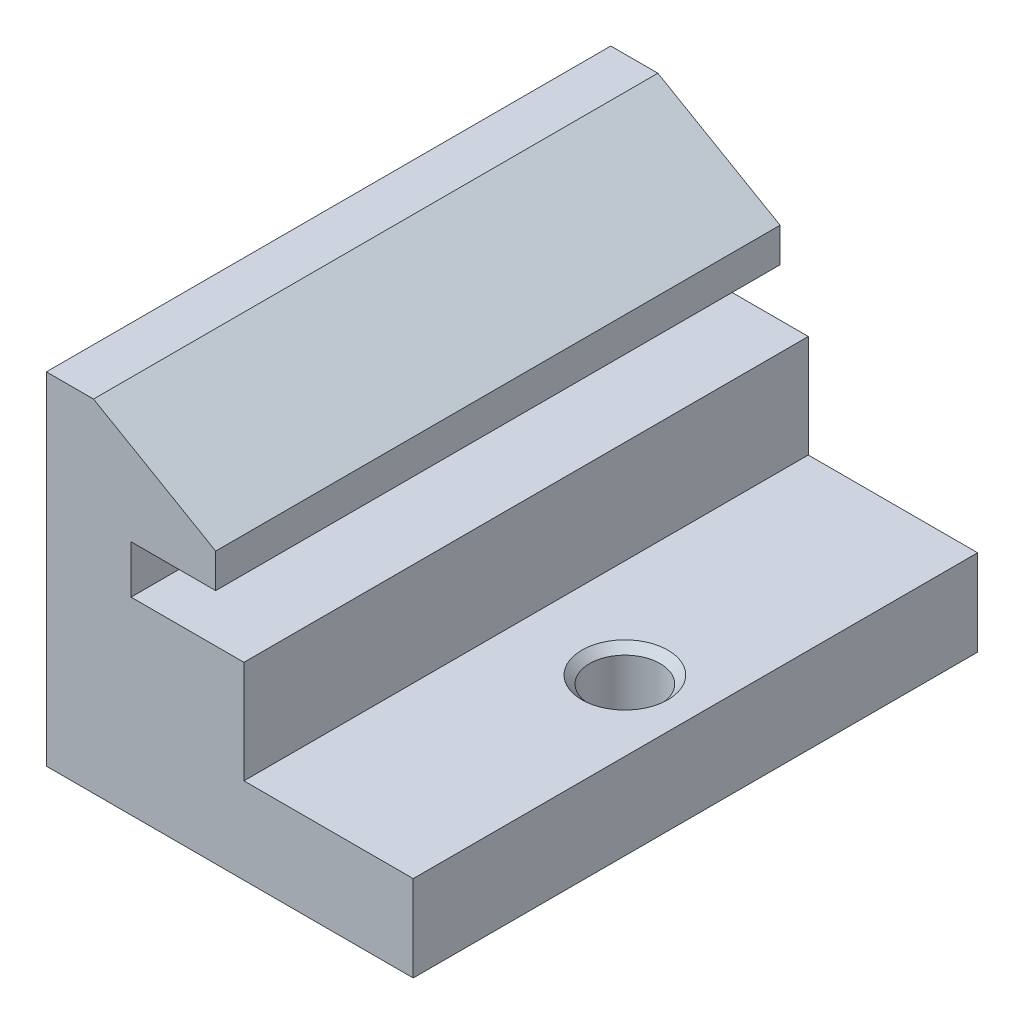
ISO-10303-21;
HEADER;
FILE_DESCRIPTION(('STEP AP214'),'2;1');
FILE_NAME('part.step','',(''),(''),'','','');
FILE_SCHEMA(('AUTOMOTIVE_DESIGN { 1 0 10303 214 1 1 1 1 }'));
ENDSEC;
DATA;
#1=APPLICATION_CONTEXT('core data for automotive mechanical design processes');
#2=APPLICATION_PROTOCOL_DEFINITION('international standard','automotive_design',2000,#1);
#3=PRODUCT_CONTEXT('',#1,'mechanical');
#4=PRODUCT('Part','Part','',(#3));
#5=PRODUCT_RELATED_PRODUCT_CATEGORY('part','',(#4));
#6=PRODUCT_DEFINITION_FORMATION('','',#4);
#7=PRODUCT_DEFINITION_CONTEXT('part definition',#1,'design');
#8=PRODUCT_DEFINITION('design','',#6,#7);
#9=PRODUCT_DEFINITION_SHAPE('','',#8);
#10=(LENGTH_UNIT() NAMED_UNIT(*) SI_UNIT(.MILLI.,.METRE.));
#11=(NAMED_UNIT(*) PLANE_ANGLE_UNIT() SI_UNIT($,.RADIAN.));
#12=(NAMED_UNIT(*) SI_UNIT($,.STERADIAN.) SOLID_ANGLE_UNIT());
#13=UNCERTAINTY_MEASURE_WITH_UNIT(LENGTH_MEASURE(1.E-05),#10,'distance_accuracy_value','');
#14=(GEOMETRIC_REPRESENTATION_CONTEXT(3) GLOBAL_UNCERTAINTY_ASSIGNED_CONTEXT((#13)) GLOBAL_UNIT_ASSIGNED_CONTEXT((#10,
#11,#12)) REPRESENTATION_CONTEXT('',''));
#15=CARTESIAN_POINT('',(0.,0.,0.));
#16=DIRECTION('',(0.,0.,1.));
#17=DIRECTION('',(1.,0.,0.));
#18=AXIS2_PLACEMENT_3D('',#15,#16,#17);
#19=CARTESIAN_POINT('',(0.,0.,20.));
#20=DIRECTION('',(-1.,0.,0.));
#21=DIRECTION('',(0.,0.,1.));
#22=AXIS2_PLACEMENT_3D('',#19,#20,#21);
#23=PLANE('',#22);
#24=DIRECTION('',(0.,1.,0.));
#25=VECTOR('',#24,1.);
#26=CARTESIAN_POINT('',(0.,0.,0.));
#27=LINE('',#26,#25);
#28=CARTESIAN_POINT('',(0.,0.,0.));
#29=VERTEX_POINT('',#28);
#30=CARTESIAN_POINT('',(0.,1.7,0.));
#31=VERTEX_POINT('',#30);
#32=EDGE_CURVE('E138',#29,#31,#27,.T.);
#33=ORIENTED_EDGE('',*,*,#32,.T.);
#34=DIRECTION('',(0.,0.,-1.));
#35=VECTOR('',#34,1.);
#36=CARTESIAN_POINT('',(0.,1.7,20.));
#37=LINE('',#36,#35);
#38=CARTESIAN_POINT('',(0.,1.7,20.));
#39=VERTEX_POINT('',#38);
#40=EDGE_CURVE('E120',#39,#31,#37,.T.);
#41=ORIENTED_EDGE('',*,*,#40,.F.);
#42=DIRECTION('',(0.,1.,0.));
#43=VECTOR('',#42,1.);
#44=CARTESIAN_POINT('',(0.,0.,20.));
#45=LINE('',#44,#43);
#46=CARTESIAN_POINT('',(0.,0.,20.));
#47=VERTEX_POINT('',#46);
#48=EDGE_CURVE('E126',#47,#39,#45,.T.);
#49=ORIENTED_EDGE('',*,*,#48,.F.);
#50=DIRECTION('',(0.,0.,-1.));
#51=VECTOR('',#50,1.);
#52=CARTESIAN_POINT('',(0.,0.,20.));
#53=LINE('',#52,#51);
#54=EDGE_CURVE('E164',#47,#29,#53,.T.);
#55=ORIENTED_EDGE('',*,*,#54,.T.);
#56=EDGE_LOOP('',(#33,#41,#49,#55));
#57=FACE_BOUND('',#56,.T.);
#58=ADVANCED_FACE('F33',(#57),#23,.F.);
#59=CARTESIAN_POINT('',(0.,1.7,20.));
#60=DIRECTION('',(0.,1.,0.));
#61=DIRECTION('',(0.,0.,1.));
#62=AXIS2_PLACEMENT_3D('',#59,#60,#61);
#63=PLANE('',#62);
#64=DIRECTION('',(1.,0.,0.));
#65=VECTOR('',#64,1.);
#66=CARTESIAN_POINT('',(0.,1.7,0.));
#67=LINE('',#66,#65);
#68=CARTESIAN_POINT('',(3.,1.7,0.));
#69=VERTEX_POINT('',#68);
#70=EDGE_CURVE('E181',#31,#69,#67,.T.);
#71=ORIENTED_EDGE('',*,*,#70,.T.);
#72=DIRECTION('',(0.,0.,-1.));
#73=VECTOR('',#72,1.);
#74=CARTESIAN_POINT('',(3.,1.7,20.));
#75=LINE('',#74,#73);
#76=CARTESIAN_POINT('',(3.,1.7,20.));
#77=VERTEX_POINT('',#76);
#78=EDGE_CURVE('E123',#77,#69,#75,.T.);
#79=ORIENTED_EDGE('',*,*,#78,.F.);
#80=DIRECTION('',(1.,0.,0.));
#81=VECTOR('',#80,1.);
#82=CARTESIAN_POINT('',(0.,1.7,20.));
#83=LINE('',#82,#81);
#84=EDGE_CURVE('E116',#39,#77,#83,.T.);
#85=ORIENTED_EDGE('',*,*,#84,.F.);
#86=ORIENTED_EDGE('',*,*,#40,.T.);
#87=EDGE_LOOP('',(#71,#79,#85,#86));
#88=FACE_BOUND('',#87,.T.);
#89=ADVANCED_FACE('F118',(#88),#63,.F.);
#90=CARTESIAN_POINT('',(3.,1.7,20.));
#91=DIRECTION('',(-1.,0.,0.));
#92=DIRECTION('',(0.,0.,1.));
#93=AXIS2_PLACEMENT_3D('',#90,#91,#92);
#94=PLANE('',#93);
#95=DIRECTION('',(0.,1.,0.));
#96=VECTOR('',#95,1.);
#97=CARTESIAN_POINT('',(3.,1.7,0.));
#98=LINE('',#97,#96);
#99=CARTESIAN_POINT('',(3.,2.91443072064569,0.));
#100=VERTEX_POINT('',#99);
#101=EDGE_CURVE('E179',#69,#100,#98,.T.);
#102=ORIENTED_EDGE('',*,*,#101,.T.);
#103=DIRECTION('',(0.,0.,1.));
#104=VECTOR('',#103,1.);
#105=CARTESIAN_POINT('',(3.,2.91443072064569,20.));
#106=LINE('',#105,#104);
#107=CARTESIAN_POINT('',(3.,2.91443072064569,20.));
#108=VERTEX_POINT('',#107);
#109=EDGE_CURVE('E41',#100,#108,#106,.T.);
#110=ORIENTED_EDGE('',*,*,#109,.T.);
#111=DIRECTION('',(0.,1.,0.));
#112=VECTOR('',#111,1.);
#113=CARTESIAN_POINT('',(3.,1.7,20.));
#114=LINE('',#113,#112);
#115=EDGE_CURVE('E125',#77,#108,#114,.T.);
#116=ORIENTED_EDGE('',*,*,#115,.F.);
#117=ORIENTED_EDGE('',*,*,#78,.T.);
#118=EDGE_LOOP('',(#102,#110,#116,#117));
#119=FACE_BOUND('',#118,.T.);
#120=ADVANCED_FACE('F242',(#119),#94,.F.);
#121=CARTESIAN_POINT('',(3.,5.41443072064569,20.));
#122=DIRECTION('',(0.,-1.,0.));
#123=DIRECTION('',(1.,0.,0.));
#124=AXIS2_PLACEMENT_3D('',#121,#122,#123);
#125=PLANE('',#124);
#126=DIRECTION('',(-1.,0.,0.));
#127=VECTOR('',#126,1.);
#128=CARTESIAN_POINT('',(3.,5.41443072064569,20.));
#129=LINE('',#128,#127);
#130=CARTESIAN_POINT('',(-1.33012701892219,5.41443072064569,20.));
#131=VERTEX_POINT('',#130);
#132=CARTESIAN_POINT('',(-3.,5.41443072064569,20.));
#133=VERTEX_POINT('',#132);
#134=EDGE_CURVE('E196',#131,#133,#129,.T.);
#135=ORIENTED_EDGE('',*,*,#134,.F.);
#136=DIRECTION('',(0.,0.,-1.));
#137=VECTOR('',#136,1.);
#138=CARTESIAN_POINT('',(-1.33012701892219,5.41443072064569,20.));
#139=LINE('',#138,#137);
#140=CARTESIAN_POINT('',(-1.33012701892219,5.41443072064569,0.));
#141=VERTEX_POINT('',#140);
#142=EDGE_CURVE('E139',#131,#141,#139,.T.);
#143=ORIENTED_EDGE('',*,*,#142,.T.);
#144=DIRECTION('',(-1.,0.,0.));
#145=VECTOR('',#144,1.);
#146=CARTESIAN_POINT('',(3.,5.41443072064569,0.));
#147=LINE('',#146,#145);
#148=CARTESIAN_POINT('',(-3.,5.41443072064569,0.));
#149=VERTEX_POINT('',#148);
#150=EDGE_CURVE('E177',#141,#149,#147,.T.);
#151=ORIENTED_EDGE('',*,*,#150,.T.);
#152=DIRECTION('',(0.,0.,-1.));
#153=VECTOR('',#152,1.);
#154=CARTESIAN_POINT('',(-3.,5.41443072064569,20.));
#155=LINE('',#154,#153);
#156=EDGE_CURVE('E143',#133,#149,#155,.T.);
#157=ORIENTED_EDGE('',*,*,#156,.F.);
#158=EDGE_LOOP('',(#135,#143,#151,#157));
#159=FACE_BOUND('',#158,.T.);
#160=ADVANCED_FACE('F247',(#159),#125,.F.);
#161=CARTESIAN_POINT('',(-3.,5.41443072064569,20.));
#162=DIRECTION('',(1.,0.,0.));
#163=DIRECTION('',(0.,1.,0.));
#164=AXIS2_PLACEMENT_3D('',#161,#162,#163);
#165=PLANE('',#164);
#166=DIRECTION('',(0.,-1.,0.));
#167=VECTOR('',#166,1.);
#168=CARTESIAN_POINT('',(-3.,5.41443072064569,0.));
#169=LINE('',#168,#167);
#170=CARTESIAN_POINT('',(-3.,-6.68821772013365,0.));
#171=VERTEX_POINT('',#170);
#172=EDGE_CURVE('E175',#149,#171,#169,.T.);
#173=ORIENTED_EDGE('',*,*,#172,.T.);
#174=DIRECTION('',(0.,0.,-1.));
#175=VECTOR('',#174,1.);
#176=CARTESIAN_POINT('',(-3.,-6.68821772013365,20.));
#177=LINE('',#176,#175);
#178=CARTESIAN_POINT('',(-3.,-6.68821772013365,20.));
#179=VERTEX_POINT('',#178);
#180=EDGE_CURVE('E149',#179,#171,#177,.T.);
#181=ORIENTED_EDGE('',*,*,#180,.F.);
#182=DIRECTION('',(0.,-1.,0.));
#183=VECTOR('',#182,1.);
#184=CARTESIAN_POINT('',(-3.,5.41443072064569,20.));
#185=LINE('',#184,#183);
#186=EDGE_CURVE('E194',#133,#179,#185,.T.);
#187=ORIENTED_EDGE('',*,*,#186,.F.);
#188=ORIENTED_EDGE('',*,*,#156,.T.);
#189=EDGE_LOOP('',(#173,#181,#187,#188));
#190=FACE_BOUND('',#189,.T.);
#191=ADVANCED_FACE('F250',(#190),#165,.F.);
#192=CARTESIAN_POINT('',(-3.,-6.68821772013365,20.));
#193=DIRECTION('',(0.,1.,0.));
#194=DIRECTION('',(0.,0.,1.));
#195=AXIS2_PLACEMENT_3D('',#192,#193,#194);
#196=PLANE('',#195);
#197=CARTESIAN_POINT('',(7.5,-6.68821772013365,10.));
#198=DIRECTION('',(0.,1.,0.));
#199=DIRECTION('',(0.,0.,1.));
#200=AXIS2_PLACEMENT_3D('',#197,#198,#199);
#201=CIRCLE('',#200,1.25);
#202=CARTESIAN_POINT('',(7.5,-6.68821772013365,11.25));
#203=VERTEX_POINT('',#202);
#204=EDGE_CURVE('E184',#203,#203,#201,.T.);
#205=ORIENTED_EDGE('',*,*,#204,.T.);
#206=EDGE_LOOP('',(#205));
#207=FACE_BOUND('',#206,.T.);
#208=DIRECTION('',(1.,0.,0.));
#209=VECTOR('',#208,1.);
#210=CARTESIAN_POINT('',(-3.,-6.68821772013365,0.));
#211=LINE('',#210,#209);
#212=CARTESIAN_POINT('',(10.,-6.68821772013365,0.));
#213=VERTEX_POINT('',#212);
#214=EDGE_CURVE('E173',#171,#213,#211,.T.);
#215=ORIENTED_EDGE('',*,*,#214,.T.);
#216=DIRECTION('',(0.,0.,-1.));
#217=VECTOR('',#216,1.);
#218=CARTESIAN_POINT('',(10.,-6.68821772013365,20.));
#219=LINE('',#218,#217);
#220=CARTESIAN_POINT('',(10.,-6.68821772013365,20.));
#221=VERTEX_POINT('',#220);
#222=EDGE_CURVE('E152',#221,#213,#219,.T.);
#223=ORIENTED_EDGE('',*,*,#222,.F.);
#224=DIRECTION('',(1.,0.,0.));
#225=VECTOR('',#224,1.);
#226=CARTESIAN_POINT('',(-3.,-6.68821772013365,20.));
#227=LINE('',#226,#225);
#228=EDGE_CURVE('E192',#179,#221,#227,.T.);
#229=ORIENTED_EDGE('',*,*,#228,.F.);
#230=ORIENTED_EDGE('',*,*,#180,.T.);
#231=EDGE_LOOP('',(#215,#223,#229,#230));
#232=FACE_BOUND('',#231,.T.);
#233=ADVANCED_FACE('F254',(#207,#232),#196,.F.);
#234=CARTESIAN_POINT('',(10.,-6.68821772013365,20.));
#235=DIRECTION('',(-1.,0.,0.));
#236=DIRECTION('',(0.,0.,1.));
#237=AXIS2_PLACEMENT_3D('',#234,#235,#236);
#238=PLANE('',#237);
#239=DIRECTION('',(0.,1.,0.));
#240=VECTOR('',#239,1.);
#241=CARTESIAN_POINT('',(10.,-6.68821772013365,0.));
#242=LINE('',#241,#240);
#243=CARTESIAN_POINT('',(10.,-3.63795673099414,0.));
#244=VERTEX_POINT('',#243);
#245=EDGE_CURVE('E171',#213,#244,#242,.T.);
#246=ORIENTED_EDGE('',*,*,#245,.T.);
#247=DIRECTION('',(0.,0.,-1.));
#248=VECTOR('',#247,1.);
#249=CARTESIAN_POINT('',(10.,-3.63795673099414,20.));
#250=LINE('',#249,#248);
#251=CARTESIAN_POINT('',(10.,-3.63795673099414,20.));
#252=VERTEX_POINT('',#251);
#253=EDGE_CURVE('E155',#252,#244,#250,.T.);
#254=ORIENTED_EDGE('',*,*,#253,.F.);
#255=DIRECTION('',(0.,1.,0.));
#256=VECTOR('',#255,1.);
#257=CARTESIAN_POINT('',(10.,-6.68821772013365,20.));
#258=LINE('',#257,#256);
#259=EDGE_CURVE('E190',#221,#252,#258,.T.);
#260=ORIENTED_EDGE('',*,*,#259,.F.);
#261=ORIENTED_EDGE('',*,*,#222,.T.);
#262=EDGE_LOOP('',(#246,#254,#260,#261));
#263=FACE_BOUND('',#262,.T.);
#264=ADVANCED_FACE('F214',(#263),#238,.F.);
#265=CARTESIAN_POINT('',(10.,-3.63795673099414,20.));
#266=DIRECTION('',(0.,-1.,0.));
#267=DIRECTION('',(1.,0.,0.));
#268=AXIS2_PLACEMENT_3D('',#265,#266,#267);
#269=PLANE('',#268);
#270=CARTESIAN_POINT('',(7.5,-3.63795673099414,10.));
#271=DIRECTION('',(0.,1.,0.));
#272=DIRECTION('',(0.,0.,1.));
#273=AXIS2_PLACEMENT_3D('',#270,#271,#272);
#274=CIRCLE('',#273,1.525);
#275=CARTESIAN_POINT('',(7.5,-3.63795673099414,11.525));
#276=VERTEX_POINT('',#275);
#277=EDGE_CURVE('E204',#276,#276,#274,.T.);
#278=ORIENTED_EDGE('',*,*,#277,.F.);
#279=EDGE_LOOP('',(#278));
#280=FACE_BOUND('',#279,.T.);
#281=DIRECTION('',(-1.,0.,0.));
#282=VECTOR('',#281,1.);
#283=CARTESIAN_POINT('',(10.,-3.63795673099414,0.));
#284=LINE('',#283,#282);
#285=CARTESIAN_POINT('',(4.,-3.63795673099414,0.));
#286=VERTEX_POINT('',#285);
#287=EDGE_CURVE('E169',#244,#286,#284,.T.);
#288=ORIENTED_EDGE('',*,*,#287,.T.);
#289=DIRECTION('',(0.,0.,-1.));
#290=VECTOR('',#289,1.);
#291=CARTESIAN_POINT('',(4.,-3.63795673099414,20.));
#292=LINE('',#291,#290);
#293=CARTESIAN_POINT('',(4.,-3.63795673099414,20.));
#294=VERTEX_POINT('',#293);
#295=EDGE_CURVE('E158',#294,#286,#292,.T.);
#296=ORIENTED_EDGE('',*,*,#295,.F.);
#297=DIRECTION('',(-1.,0.,0.));
#298=VECTOR('',#297,1.);
#299=CARTESIAN_POINT('',(10.,-3.63795673099414,20.));
#300=LINE('',#299,#298);
#301=EDGE_CURVE('E188',#252,#294,#300,.T.);
#302=ORIENTED_EDGE('',*,*,#301,.F.);
#303=ORIENTED_EDGE('',*,*,#253,.T.);
#304=EDGE_LOOP('',(#288,#296,#302,#303));
#305=FACE_BOUND('',#304,.T.);
#306=ADVANCED_FACE('F210',(#280,#305),#269,.F.);
#307=CARTESIAN_POINT('',(4.,-3.63795673099414,20.));
#308=DIRECTION('',(-1.,0.,0.));
#309=DIRECTION('',(0.,0.,1.));
#310=AXIS2_PLACEMENT_3D('',#307,#308,#309);
#311=PLANE('',#310);
#312=DIRECTION('',(0.,1.,0.));
#313=VECTOR('',#312,1.);
#314=CARTESIAN_POINT('',(4.,-3.63795673099414,0.));
#315=LINE('',#314,#313);
#316=CARTESIAN_POINT('',(4.,0.,0.));
#317=VERTEX_POINT('',#316);
#318=EDGE_CURVE('E167',#286,#317,#315,.T.);
#319=ORIENTED_EDGE('',*,*,#318,.T.);
#320=DIRECTION('',(0.,0.,-1.));
#321=VECTOR('',#320,1.);
#322=CARTESIAN_POINT('',(4.,0.,20.));
#323=LINE('',#322,#321);
#324=CARTESIAN_POINT('',(4.,0.,20.));
#325=VERTEX_POINT('',#324);
#326=EDGE_CURVE('E161',#325,#317,#323,.T.);
#327=ORIENTED_EDGE('',*,*,#326,.F.);
#328=DIRECTION('',(0.,1.,0.));
#329=VECTOR('',#328,1.);
#330=CARTESIAN_POINT('',(4.,-3.63795673099414,20.));
#331=LINE('',#330,#329);
#332=EDGE_CURVE('E186',#294,#325,#331,.T.);
#333=ORIENTED_EDGE('',*,*,#332,.F.);
#334=ORIENTED_EDGE('',*,*,#295,.T.);
#335=EDGE_LOOP('',(#319,#327,#333,#334));
#336=FACE_BOUND('',#335,.T.);
#337=ADVANCED_FACE('F213',(#336),#311,.F.);
#338=CARTESIAN_POINT('',(0.,0.,20.));
#339=DIRECTION('',(0.,-1.,0.));
#340=DIRECTION('',(0.,0.,-1.));
#341=AXIS2_PLACEMENT_3D('',#338,#339,#340);
#342=PLANE('',#341);
#343=DIRECTION('',(-1.,0.,0.));
#344=VECTOR('',#343,1.);
#345=CARTESIAN_POINT('',(0.,0.,0.));
#346=LINE('',#345,#344);
#347=EDGE_CURVE('E135',#317,#29,#346,.T.);
#348=ORIENTED_EDGE('',*,*,#347,.T.);
#349=ORIENTED_EDGE('',*,*,#54,.F.);
#350=DIRECTION('',(-1.,0.,0.));
#351=VECTOR('',#350,1.);
#352=CARTESIAN_POINT('',(0.,0.,20.));
#353=LINE('',#352,#351);
#354=EDGE_CURVE('E131',#325,#47,#353,.T.);
#355=ORIENTED_EDGE('',*,*,#354,.F.);
#356=ORIENTED_EDGE('',*,*,#326,.T.);
#357=EDGE_LOOP('',(#348,#349,#355,#356));
#358=FACE_BOUND('',#357,.T.);
#359=ADVANCED_FACE('F228',(#358),#342,.F.);
#360=CARTESIAN_POINT('',(0.,0.,20.));
#361=DIRECTION('',(0.,0.,-1.));
#362=DIRECTION('',(-1.,0.,0.));
#363=AXIS2_PLACEMENT_3D('',#360,#361,#362);
#364=PLANE('',#363);
#365=ORIENTED_EDGE('',*,*,#115,.T.);
#366=DIRECTION('',(0.866025403784438,-0.500000000000001,0.));
#367=VECTOR('',#366,1.);
#368=CARTESIAN_POINT('',(-1.33012701892219,5.41443072064569,20.));
#369=LINE('',#368,#367);
#370=EDGE_CURVE('E11',#108,#131,#369,.F.);
#371=ORIENTED_EDGE('',*,*,#370,.T.);
#372=ORIENTED_EDGE('',*,*,#134,.T.);
#373=ORIENTED_EDGE('',*,*,#186,.T.);
#374=ORIENTED_EDGE('',*,*,#228,.T.);
#375=ORIENTED_EDGE('',*,*,#259,.T.);
#376=ORIENTED_EDGE('',*,*,#301,.T.);
#377=ORIENTED_EDGE('',*,*,#332,.T.);
#378=ORIENTED_EDGE('',*,*,#354,.T.);
#379=ORIENTED_EDGE('',*,*,#48,.T.);
#380=ORIENTED_EDGE('',*,*,#84,.T.);
#381=EDGE_LOOP('',(#365,#371,#372,#373,#374,#375,#376,#377,#378,#379,#380));
#382=FACE_BOUND('',#381,.T.);
#383=ADVANCED_FACE('F129',(#382),#364,.F.);
#384=CARTESIAN_POINT('',(0.,0.,0.));
#385=DIRECTION('',(0.,0.,-1.));
#386=DIRECTION('',(-1.,0.,0.));
#387=AXIS2_PLACEMENT_3D('',#384,#385,#386);
#388=PLANE('',#387);
#389=ORIENTED_EDGE('',*,*,#150,.F.);
#390=DIRECTION('',(-0.866025403784438,0.500000000000001,0.));
#391=VECTOR('',#390,1.);
#392=CARTESIAN_POINT('',(2.01198552082448,3.48486114616093,0.));
#393=LINE('',#392,#391);
#394=EDGE_CURVE('E55',#141,#100,#393,.F.);
#395=ORIENTED_EDGE('',*,*,#394,.T.);
#396=ORIENTED_EDGE('',*,*,#101,.F.);
#397=ORIENTED_EDGE('',*,*,#70,.F.);
#398=ORIENTED_EDGE('',*,*,#32,.F.);
#399=ORIENTED_EDGE('',*,*,#347,.F.);
#400=ORIENTED_EDGE('',*,*,#318,.F.);
#401=ORIENTED_EDGE('',*,*,#287,.F.);
#402=ORIENTED_EDGE('',*,*,#245,.F.);
#403=ORIENTED_EDGE('',*,*,#214,.F.);
#404=ORIENTED_EDGE('',*,*,#172,.F.);
#405=EDGE_LOOP('',(#389,#395,#396,#397,#398,#399,#400,#401,#402,#403,#404));
#406=FACE_BOUND('',#405,.T.);
#407=ADVANCED_FACE('F226',(#406),#388,.T.);
#408=CARTESIAN_POINT('',(7.5,-3.63795673099414,10.));
#409=DIRECTION('',(0.,1.,0.));
#410=DIRECTION('',(0.,0.,1.));
#411=AXIS2_PLACEMENT_3D('',#408,#409,#410);
#412=CYLINDRICAL_SURFACE('',#411,1.25);
#413=ORIENTED_EDGE('',*,*,#204,.F.);
#414=EDGE_LOOP('',(#413));
#415=FACE_BOUND('',#414,.T.);
#416=CARTESIAN_POINT('',(7.5,-3.91295673099414,10.));
#417=DIRECTION('',(0.,1.,0.));
#418=DIRECTION('',(0.,0.,1.));
#419=AXIS2_PLACEMENT_3D('',#416,#417,#418);
#420=CIRCLE('',#419,1.25);
#421=CARTESIAN_POINT('',(7.5,-3.91295673099414,11.25));
#422=VERTEX_POINT('',#421);
#423=EDGE_CURVE('E201',#422,#422,#420,.T.);
#424=ORIENTED_EDGE('',*,*,#423,.T.);
#425=EDGE_LOOP('',(#424));
#426=FACE_BOUND('',#425,.T.);
#427=ADVANCED_FACE('F280',(#415,#426),#412,.F.);
#428=CARTESIAN_POINT('',(7.5,-3.63795673099414,10.));
#429=DIRECTION('',(0.,1.,0.));
#430=DIRECTION('',(0.,0.,1.));
#431=AXIS2_PLACEMENT_3D('',#428,#429,#430);
#432=CONICAL_SURFACE('',#431,1.525,0.785398163397447);
#433=ORIENTED_EDGE('',*,*,#423,.F.);
#434=EDGE_LOOP('',(#433));
#435=FACE_BOUND('',#434,.T.);
#436=ORIENTED_EDGE('',*,*,#277,.T.);
#437=EDGE_LOOP('',(#436));
#438=FACE_BOUND('',#437,.T.);
#439=ADVANCED_FACE('F208',(#435,#438),#432,.F.);
#440=CARTESIAN_POINT('',(-1.33012701892219,5.41443072064569,20.));
#441=DIRECTION('',(-0.500000000000001,-0.866025403784438,0.));
#442=DIRECTION('',(0.,0.,-1.));
#443=AXIS2_PLACEMENT_3D('',#440,#441,#442);
#444=PLANE('',#443);
#445=ORIENTED_EDGE('',*,*,#370,.F.);
#446=ORIENTED_EDGE('',*,*,#109,.F.);
#447=ORIENTED_EDGE('',*,*,#394,.F.);
#448=ORIENTED_EDGE('',*,*,#142,.F.);
#449=EDGE_LOOP('',(#445,#446,#447,#448));
#450=FACE_BOUND('',#449,.T.);
#451=ADVANCED_FACE('F35',(#450),#444,.F.);
#452=CLOSED_SHELL('',(#58,#89,#120,#160,#191,#233,#264,#306,#337,#359,#383,#407,#427,#439,#451));
#453=MANIFOLD_SOLID_BREP('B2',#452);
#454=ADVANCED_BREP_SHAPE_REPRESENTATION('',(#18,#453),#14);
#455=SHAPE_DEFINITION_REPRESENTATION(#9,#454);
ENDSEC;
END-ISO-10303-21;
